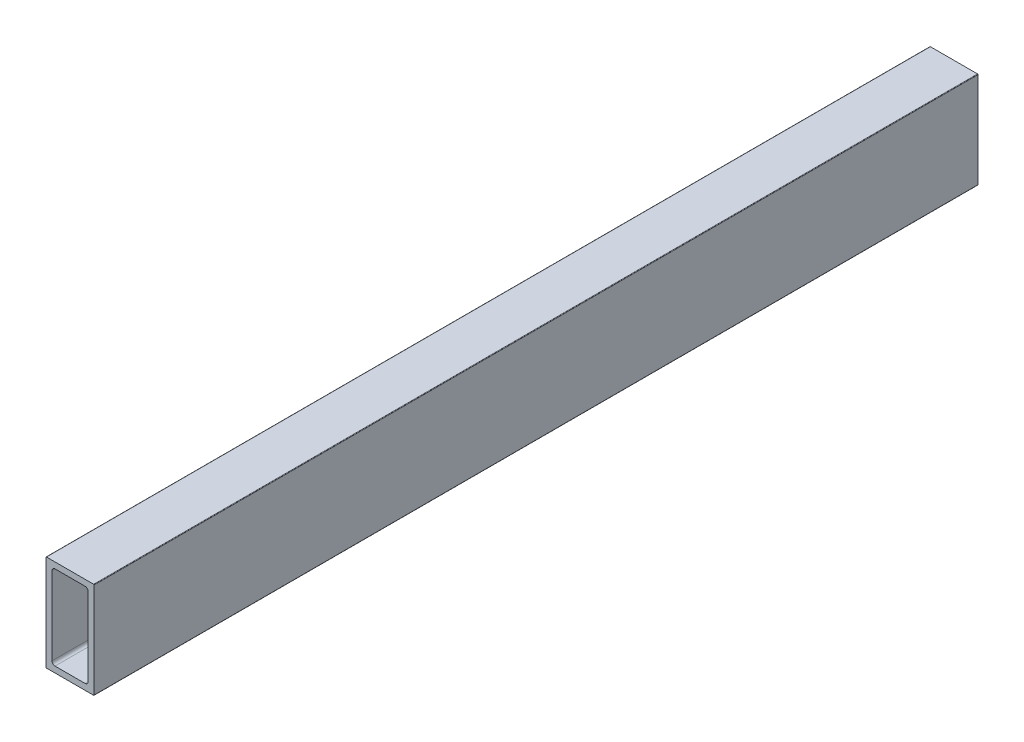
ISO-10303-21;
HEADER;
FILE_DESCRIPTION(('STEP AP214'),'2;1');
FILE_NAME('part.step','',(''),(''),'','','');
FILE_SCHEMA(('AUTOMOTIVE_DESIGN { 1 0 10303 214 1 1 1 1 }'));
ENDSEC;
DATA;
#1=APPLICATION_CONTEXT('core data for automotive mechanical design processes');
#2=APPLICATION_PROTOCOL_DEFINITION('international standard','automotive_design',2000,#1);
#3=PRODUCT_CONTEXT('',#1,'mechanical');
#4=PRODUCT('Part','Part','',(#3));
#5=PRODUCT_RELATED_PRODUCT_CATEGORY('part','',(#4));
#6=PRODUCT_DEFINITION_FORMATION('','',#4);
#7=PRODUCT_DEFINITION_CONTEXT('part definition',#1,'design');
#8=PRODUCT_DEFINITION('design','',#6,#7);
#9=PRODUCT_DEFINITION_SHAPE('','',#8);
#10=(LENGTH_UNIT() NAMED_UNIT(*) SI_UNIT(.MILLI.,.METRE.));
#11=(NAMED_UNIT(*) PLANE_ANGLE_UNIT() SI_UNIT($,.RADIAN.));
#12=(NAMED_UNIT(*) SI_UNIT($,.STERADIAN.) SOLID_ANGLE_UNIT());
#13=UNCERTAINTY_MEASURE_WITH_UNIT(LENGTH_MEASURE(1.E-05),#10,'distance_accuracy_value','');
#14=(GEOMETRIC_REPRESENTATION_CONTEXT(3) GLOBAL_UNCERTAINTY_ASSIGNED_CONTEXT((#13)) GLOBAL_UNIT_ASSIGNED_CONTEXT((#10,
#11,#12)) REPRESENTATION_CONTEXT('',''));
#15=CARTESIAN_POINT('',(0.,0.,0.));
#16=DIRECTION('',(0.,0.,1.));
#17=DIRECTION('',(1.,0.,0.));
#18=AXIS2_PLACEMENT_3D('',#15,#16,#17);
#19=CARTESIAN_POINT('',(3.175,4.7625,1828.8));
#20=DIRECTION('',(1.,0.,0.));
#21=DIRECTION('',(0.,1.,0.));
#22=AXIS2_PLACEMENT_3D('',#19,#20,#21);
#23=PLANE('',#22);
#24=DIRECTION('',(0.,1.,0.));
#25=VECTOR('',#24,1.);
#26=CARTESIAN_POINT('',(3.175,4.76250000000024,466.725));
#27=LINE('',#26,#25);
#28=CARTESIAN_POINT('',(3.175,4.7625,466.725));
#29=VERTEX_POINT('',#28);
#30=CARTESIAN_POINT('',(3.175,46.0375,466.725));
#31=VERTEX_POINT('',#30);
#32=EDGE_CURVE('E241',#29,#31,#27,.T.);
#33=ORIENTED_EDGE('',*,*,#32,.F.);
#34=DIRECTION('',(0.,0.,-1.));
#35=VECTOR('',#34,1.);
#36=CARTESIAN_POINT('',(3.175,4.7625,1828.8));
#37=LINE('',#36,#35);
#38=CARTESIAN_POINT('',(3.175,4.7625,0.));
#39=VERTEX_POINT('',#38);
#40=EDGE_CURVE('E211',#29,#39,#37,.T.);
#41=ORIENTED_EDGE('',*,*,#40,.T.);
#42=DIRECTION('',(0.,-1.,0.));
#43=VECTOR('',#42,1.);
#44=CARTESIAN_POINT('',(3.175,4.7625,0.));
#45=LINE('',#44,#43);
#46=CARTESIAN_POINT('',(3.175,46.0375,0.));
#47=VERTEX_POINT('',#46);
#48=EDGE_CURVE('E247',#47,#39,#45,.T.);
#49=ORIENTED_EDGE('',*,*,#48,.F.);
#50=DIRECTION('',(0.,0.,-1.));
#51=VECTOR('',#50,1.);
#52=CARTESIAN_POINT('',(3.175,46.0375,1828.8));
#53=LINE('',#52,#51);
#54=EDGE_CURVE('E51',#31,#47,#53,.T.);
#55=ORIENTED_EDGE('',*,*,#54,.F.);
#56=EDGE_LOOP('',(#33,#41,#49,#55));
#57=FACE_BOUND('',#56,.T.);
#58=ADVANCED_FACE('F43',(#57),#23,.T.);
#59=CARTESIAN_POINT('',(4.7625,46.0375,1828.8));
#60=DIRECTION('',(0.,0.,-1.));
#61=DIRECTION('',(-1.,0.,0.));
#62=AXIS2_PLACEMENT_3D('',#59,#60,#61);
#63=CYLINDRICAL_SURFACE('',#62,1.5875);
#64=DIRECTION('',(0.,0.,-1.));
#65=VECTOR('',#64,1.);
#66=CARTESIAN_POINT('',(4.7625,47.625,1828.8));
#67=LINE('',#66,#65);
#68=CARTESIAN_POINT('',(4.7625,47.625,466.725));
#69=VERTEX_POINT('',#68);
#70=CARTESIAN_POINT('',(4.7625,47.625,0.));
#71=VERTEX_POINT('',#70);
#72=EDGE_CURVE('E223',#69,#71,#67,.T.);
#73=ORIENTED_EDGE('',*,*,#72,.F.);
#74=CARTESIAN_POINT('',(4.7625,46.0375,466.725));
#75=DIRECTION('',(0.,0.,-1.));
#76=DIRECTION('',(0.,1.,0.));
#77=AXIS2_PLACEMENT_3D('',#74,#75,#76);
#78=CIRCLE('',#77,1.5875);
#79=EDGE_CURVE('E355',#69,#31,#78,.F.);
#80=ORIENTED_EDGE('',*,*,#79,.T.);
#81=ORIENTED_EDGE('',*,*,#54,.T.);
#82=CARTESIAN_POINT('',(4.7625,46.0375,0.));
#83=DIRECTION('',(0.,0.,1.));
#84=DIRECTION('',(-1.,0.,0.));
#85=AXIS2_PLACEMENT_3D('',#82,#83,#84);
#86=CIRCLE('',#85,1.5875);
#87=EDGE_CURVE('E295',#71,#47,#86,.T.);
#88=ORIENTED_EDGE('',*,*,#87,.F.);
#89=EDGE_LOOP('',(#73,#80,#81,#88));
#90=FACE_BOUND('',#89,.T.);
#91=ADVANCED_FACE('F536',(#90),#63,.F.);
#92=CARTESIAN_POINT('',(4.7625,47.625,1828.8));
#93=DIRECTION('',(0.,-1.,0.));
#94=DIRECTION('',(0.,0.,-1.));
#95=AXIS2_PLACEMENT_3D('',#92,#93,#94);
#96=PLANE('',#95);
#97=DIRECTION('',(1.,0.,0.));
#98=VECTOR('',#97,1.);
#99=CARTESIAN_POINT('',(4.7625,47.625,466.725));
#100=LINE('',#99,#98);
#101=CARTESIAN_POINT('',(20.6375,47.625,466.725));
#102=VERTEX_POINT('',#101);
#103=EDGE_CURVE('E358',#69,#102,#100,.T.);
#104=ORIENTED_EDGE('',*,*,#103,.F.);
#105=ORIENTED_EDGE('',*,*,#72,.T.);
#106=DIRECTION('',(-1.,0.,0.));
#107=VECTOR('',#106,1.);
#108=CARTESIAN_POINT('',(4.7625,47.625,0.));
#109=LINE('',#108,#107);
#110=CARTESIAN_POINT('',(20.6375,47.625,0.));
#111=VERTEX_POINT('',#110);
#112=EDGE_CURVE('E288',#111,#71,#109,.T.);
#113=ORIENTED_EDGE('',*,*,#112,.F.);
#114=DIRECTION('',(0.,0.,-1.));
#115=VECTOR('',#114,1.);
#116=CARTESIAN_POINT('',(20.6375,47.625,1828.8));
#117=LINE('',#116,#115);
#118=EDGE_CURVE('E235',#102,#111,#117,.T.);
#119=ORIENTED_EDGE('',*,*,#118,.F.);
#120=EDGE_LOOP('',(#104,#105,#113,#119));
#121=FACE_BOUND('',#120,.T.);
#122=ADVANCED_FACE('F529',(#121),#96,.T.);
#123=CARTESIAN_POINT('',(20.6375,46.0375,1828.8));
#124=DIRECTION('',(0.,0.,-1.));
#125=DIRECTION('',(-1.,0.,0.));
#126=AXIS2_PLACEMENT_3D('',#123,#124,#125);
#127=CYLINDRICAL_SURFACE('',#126,1.5875);
#128=DIRECTION('',(0.,0.,-1.));
#129=VECTOR('',#128,1.);
#130=CARTESIAN_POINT('',(22.225,46.0375,1828.8));
#131=LINE('',#130,#129);
#132=CARTESIAN_POINT('',(22.225,46.0375,466.725));
#133=VERTEX_POINT('',#132);
#134=CARTESIAN_POINT('',(22.225,46.0375,0.));
#135=VERTEX_POINT('',#134);
#136=EDGE_CURVE('E232',#133,#135,#131,.T.);
#137=ORIENTED_EDGE('',*,*,#136,.F.);
#138=CARTESIAN_POINT('',(20.6375,46.0375,466.725));
#139=DIRECTION('',(0.,0.,-1.));
#140=DIRECTION('',(0.,1.,0.));
#141=AXIS2_PLACEMENT_3D('',#138,#139,#140);
#142=CIRCLE('',#141,1.5875);
#143=EDGE_CURVE('E360',#133,#102,#142,.F.);
#144=ORIENTED_EDGE('',*,*,#143,.T.);
#145=ORIENTED_EDGE('',*,*,#118,.T.);
#146=CARTESIAN_POINT('',(20.6375,46.0375,0.));
#147=DIRECTION('',(0.,0.,1.));
#148=DIRECTION('',(-1.,0.,0.));
#149=AXIS2_PLACEMENT_3D('',#146,#147,#148);
#150=CIRCLE('',#149,1.5875);
#151=EDGE_CURVE('E284',#135,#111,#150,.T.);
#152=ORIENTED_EDGE('',*,*,#151,.F.);
#153=EDGE_LOOP('',(#137,#144,#145,#152));
#154=FACE_BOUND('',#153,.T.);
#155=ADVANCED_FACE('F341',(#154),#127,.F.);
#156=CARTESIAN_POINT('',(22.225,4.7625,1828.8));
#157=DIRECTION('',(-1.,0.,0.));
#158=DIRECTION('',(0.,0.,1.));
#159=AXIS2_PLACEMENT_3D('',#156,#157,#158);
#160=PLANE('',#159);
#161=DIRECTION('',(0.,-1.,0.));
#162=VECTOR('',#161,1.);
#163=CARTESIAN_POINT('',(22.225,4.76250000000024,466.725));
#164=LINE('',#163,#162);
#165=CARTESIAN_POINT('',(22.225,4.7625,466.725));
#166=VERTEX_POINT('',#165);
#167=EDGE_CURVE('E338',#133,#166,#164,.T.);
#168=ORIENTED_EDGE('',*,*,#167,.F.);
#169=ORIENTED_EDGE('',*,*,#136,.T.);
#170=DIRECTION('',(0.,1.,0.));
#171=VECTOR('',#170,1.);
#172=CARTESIAN_POINT('',(22.225,4.7625,0.));
#173=LINE('',#172,#171);
#174=CARTESIAN_POINT('',(22.225,4.7625,0.));
#175=VERTEX_POINT('',#174);
#176=EDGE_CURVE('E289',#175,#135,#173,.T.);
#177=ORIENTED_EDGE('',*,*,#176,.F.);
#178=DIRECTION('',(0.,0.,-1.));
#179=VECTOR('',#178,1.);
#180=CARTESIAN_POINT('',(22.225,4.7625,1828.8));
#181=LINE('',#180,#179);
#182=EDGE_CURVE('E216',#166,#175,#181,.T.);
#183=ORIENTED_EDGE('',*,*,#182,.F.);
#184=EDGE_LOOP('',(#168,#169,#177,#183));
#185=FACE_BOUND('',#184,.T.);
#186=ADVANCED_FACE('F335',(#185),#160,.T.);
#187=CARTESIAN_POINT('',(20.6375,4.7625,1828.8));
#188=DIRECTION('',(0.,0.,-1.));
#189=DIRECTION('',(-1.,0.,0.));
#190=AXIS2_PLACEMENT_3D('',#187,#188,#189);
#191=CYLINDRICAL_SURFACE('',#190,1.5875);
#192=DIRECTION('',(0.,0.,-1.));
#193=VECTOR('',#192,1.);
#194=CARTESIAN_POINT('',(20.6375,3.175,1828.8));
#195=LINE('',#194,#193);
#196=CARTESIAN_POINT('',(20.6375,3.175,466.725));
#197=VERTEX_POINT('',#196);
#198=CARTESIAN_POINT('',(20.6375,3.175,0.));
#199=VERTEX_POINT('',#198);
#200=EDGE_CURVE('E213',#197,#199,#195,.T.);
#201=ORIENTED_EDGE('',*,*,#200,.F.);
#202=CARTESIAN_POINT('',(20.6375,4.7625,466.725));
#203=DIRECTION('',(0.,0.,-1.));
#204=DIRECTION('',(0.,1.,0.));
#205=AXIS2_PLACEMENT_3D('',#202,#203,#204);
#206=CIRCLE('',#205,1.5875);
#207=EDGE_CURVE('E332',#197,#166,#206,.F.);
#208=ORIENTED_EDGE('',*,*,#207,.T.);
#209=ORIENTED_EDGE('',*,*,#182,.T.);
#210=CARTESIAN_POINT('',(20.6375,4.7625,0.));
#211=DIRECTION('',(0.,0.,1.));
#212=DIRECTION('',(-1.,0.,0.));
#213=AXIS2_PLACEMENT_3D('',#210,#211,#212);
#214=CIRCLE('',#213,1.5875);
#215=EDGE_CURVE('E205',#199,#175,#214,.T.);
#216=ORIENTED_EDGE('',*,*,#215,.F.);
#217=EDGE_LOOP('',(#201,#208,#209,#216));
#218=FACE_BOUND('',#217,.T.);
#219=ADVANCED_FACE('F329',(#218),#191,.F.);
#220=CARTESIAN_POINT('',(4.7625,3.175,1828.8));
#221=DIRECTION('',(0.,1.,0.));
#222=DIRECTION('',(1.,0.,0.));
#223=AXIS2_PLACEMENT_3D('',#220,#221,#222);
#224=PLANE('',#223);
#225=DIRECTION('',(-1.,0.,0.));
#226=VECTOR('',#225,1.);
#227=CARTESIAN_POINT('',(4.7625,3.175,466.725));
#228=LINE('',#227,#226);
#229=CARTESIAN_POINT('',(4.7625,3.175,466.725));
#230=VERTEX_POINT('',#229);
#231=EDGE_CURVE('E58',#197,#230,#228,.T.);
#232=ORIENTED_EDGE('',*,*,#231,.F.);
#233=ORIENTED_EDGE('',*,*,#200,.T.);
#234=DIRECTION('',(1.,0.,0.));
#235=VECTOR('',#234,1.);
#236=CARTESIAN_POINT('',(4.7625,3.175,0.));
#237=LINE('',#236,#235);
#238=CARTESIAN_POINT('',(4.7625,3.175,0.));
#239=VERTEX_POINT('',#238);
#240=EDGE_CURVE('E242',#239,#199,#237,.T.);
#241=ORIENTED_EDGE('',*,*,#240,.F.);
#242=DIRECTION('',(0.,0.,-1.));
#243=VECTOR('',#242,1.);
#244=CARTESIAN_POINT('',(4.7625,3.175,1828.8));
#245=LINE('',#244,#243);
#246=EDGE_CURVE('E217',#230,#239,#245,.T.);
#247=ORIENTED_EDGE('',*,*,#246,.F.);
#248=EDGE_LOOP('',(#232,#233,#241,#247));
#249=FACE_BOUND('',#248,.T.);
#250=ADVANCED_FACE('F262',(#249),#224,.T.);
#251=CARTESIAN_POINT('',(4.7625,4.7625,1828.8));
#252=DIRECTION('',(0.,0.,-1.));
#253=DIRECTION('',(-1.,0.,0.));
#254=AXIS2_PLACEMENT_3D('',#251,#252,#253);
#255=CYLINDRICAL_SURFACE('',#254,1.5875);
#256=ORIENTED_EDGE('',*,*,#40,.F.);
#257=CARTESIAN_POINT('',(4.7625,4.7625,466.725));
#258=DIRECTION('',(0.,0.,-1.));
#259=DIRECTION('',(0.,1.,0.));
#260=AXIS2_PLACEMENT_3D('',#257,#258,#259);
#261=CIRCLE('',#260,1.5875);
#262=EDGE_CURVE('E260',#29,#230,#261,.F.);
#263=ORIENTED_EDGE('',*,*,#262,.T.);
#264=ORIENTED_EDGE('',*,*,#246,.T.);
#265=CARTESIAN_POINT('',(4.7625,4.7625,0.));
#266=DIRECTION('',(0.,0.,1.));
#267=DIRECTION('',(1.,0.,0.));
#268=AXIS2_PLACEMENT_3D('',#265,#266,#267);
#269=CIRCLE('',#268,1.5875);
#270=EDGE_CURVE('E246',#39,#239,#269,.T.);
#271=ORIENTED_EDGE('',*,*,#270,.F.);
#272=EDGE_LOOP('',(#256,#263,#264,#271));
#273=FACE_BOUND('',#272,.T.);
#274=ADVANCED_FACE('F258',(#273),#255,.F.);
#275=CARTESIAN_POINT('',(0.,0.254,1828.8));
#276=DIRECTION('',(1.,0.,0.));
#277=DIRECTION('',(0.,1.,0.));
#278=AXIS2_PLACEMENT_3D('',#275,#276,#277);
#279=PLANE('',#278);
#280=DIRECTION('',(0.,0.,-1.));
#281=VECTOR('',#280,1.);
#282=CARTESIAN_POINT('',(0.,0.254,1828.8));
#283=LINE('',#282,#281);
#284=CARTESIAN_POINT('',(0.,0.254,466.725));
#285=VERTEX_POINT('',#284);
#286=CARTESIAN_POINT('',(0.,0.254,0.));
#287=VERTEX_POINT('',#286);
#288=EDGE_CURVE('E202',#285,#287,#283,.T.);
#289=ORIENTED_EDGE('',*,*,#288,.F.);
#290=DIRECTION('',(0.,1.,0.));
#291=VECTOR('',#290,1.);
#292=CARTESIAN_POINT('',(0.,269.220692931555,466.725));
#293=LINE('',#292,#291);
#294=CARTESIAN_POINT('',(0.,50.546,466.725));
#295=VERTEX_POINT('',#294);
#296=EDGE_CURVE('E65',#285,#295,#293,.T.);
#297=ORIENTED_EDGE('',*,*,#296,.T.);
#298=DIRECTION('',(0.,0.,-1.));
#299=VECTOR('',#298,1.);
#300=CARTESIAN_POINT('',(0.,50.546,1828.8));
#301=LINE('',#300,#299);
#302=CARTESIAN_POINT('',(0.,50.546,0.));
#303=VERTEX_POINT('',#302);
#304=EDGE_CURVE('E208',#295,#303,#301,.T.);
#305=ORIENTED_EDGE('',*,*,#304,.T.);
#306=DIRECTION('',(0.,-1.,0.));
#307=VECTOR('',#306,1.);
#308=CARTESIAN_POINT('',(0.,0.254,0.));
#309=LINE('',#308,#307);
#310=EDGE_CURVE('E240',#303,#287,#309,.T.);
#311=ORIENTED_EDGE('',*,*,#310,.T.);
#312=EDGE_LOOP('',(#289,#297,#305,#311));
#313=FACE_BOUND('',#312,.T.);
#314=ADVANCED_FACE('F375',(#313),#279,.F.);
#315=CARTESIAN_POINT('',(0.254,50.546,1828.8));
#316=DIRECTION('',(0.,0.,-1.));
#317=DIRECTION('',(-1.,0.,0.));
#318=AXIS2_PLACEMENT_3D('',#315,#316,#317);
#319=CYLINDRICAL_SURFACE('',#318,0.253999999999995);
#320=CARTESIAN_POINT('',(0.254,50.546,466.725));
#321=DIRECTION('',(0.,0.,-1.));
#322=DIRECTION('',(0.,1.,0.));
#323=AXIS2_PLACEMENT_3D('',#320,#321,#322);
#324=CIRCLE('',#323,0.253999999999995);
#325=CARTESIAN_POINT('',(0.254,50.8,466.725));
#326=VERTEX_POINT('',#325);
#327=EDGE_CURVE('E366',#326,#295,#324,.F.);
#328=ORIENTED_EDGE('',*,*,#327,.F.);
#329=DIRECTION('',(0.,0.,-1.));
#330=VECTOR('',#329,1.);
#331=CARTESIAN_POINT('',(0.254,50.8,1828.8));
#332=LINE('',#331,#330);
#333=CARTESIAN_POINT('',(0.254,50.8,0.));
#334=VERTEX_POINT('',#333);
#335=EDGE_CURVE('E212',#326,#334,#332,.T.);
#336=ORIENTED_EDGE('',*,*,#335,.T.);
#337=CARTESIAN_POINT('',(0.254,50.546,0.));
#338=DIRECTION('',(0.,0.,1.));
#339=DIRECTION('',(-1.,0.,0.));
#340=AXIS2_PLACEMENT_3D('',#337,#338,#339);
#341=CIRCLE('',#340,0.253999999999995);
#342=EDGE_CURVE('E277',#334,#303,#341,.T.);
#343=ORIENTED_EDGE('',*,*,#342,.T.);
#344=ORIENTED_EDGE('',*,*,#304,.F.);
#345=EDGE_LOOP('',(#328,#336,#343,#344));
#346=FACE_BOUND('',#345,.T.);
#347=ADVANCED_FACE('F45',(#346),#319,.T.);
#348=CARTESIAN_POINT('',(0.254,50.8,1828.8));
#349=DIRECTION('',(0.,-1.,0.));
#350=DIRECTION('',(0.,0.,-1.));
#351=AXIS2_PLACEMENT_3D('',#348,#349,#350);
#352=PLANE('',#351);
#353=ORIENTED_EDGE('',*,*,#335,.F.);
#354=DIRECTION('',(1.,0.,0.));
#355=VECTOR('',#354,1.);
#356=CARTESIAN_POINT('',(0.254,50.8,466.725));
#357=LINE('',#356,#355);
#358=CARTESIAN_POINT('',(25.146,50.8,466.725));
#359=VERTEX_POINT('',#358);
#360=EDGE_CURVE('E368',#326,#359,#357,.T.);
#361=ORIENTED_EDGE('',*,*,#360,.T.);
#362=DIRECTION('',(0.,0.,-1.));
#363=VECTOR('',#362,1.);
#364=CARTESIAN_POINT('',(25.146,50.8,1828.8));
#365=LINE('',#364,#363);
#366=CARTESIAN_POINT('',(25.146,50.8,0.));
#367=VERTEX_POINT('',#366);
#368=EDGE_CURVE('E200',#359,#367,#365,.T.);
#369=ORIENTED_EDGE('',*,*,#368,.T.);
#370=DIRECTION('',(-1.,0.,0.));
#371=VECTOR('',#370,1.);
#372=CARTESIAN_POINT('',(0.254,50.8,0.));
#373=LINE('',#372,#371);
#374=EDGE_CURVE('E229',#367,#334,#373,.T.);
#375=ORIENTED_EDGE('',*,*,#374,.T.);
#376=EDGE_LOOP('',(#353,#361,#369,#375));
#377=FACE_BOUND('',#376,.T.);
#378=ADVANCED_FACE('F477',(#377),#352,.F.);
#379=CARTESIAN_POINT('',(25.146,50.546,1828.8));
#380=DIRECTION('',(0.,0.,-1.));
#381=DIRECTION('',(-1.,0.,0.));
#382=AXIS2_PLACEMENT_3D('',#379,#380,#381);
#383=CYLINDRICAL_SURFACE('',#382,0.253999999999994);
#384=CARTESIAN_POINT('',(25.146,50.546,466.725));
#385=DIRECTION('',(0.,0.,-1.));
#386=DIRECTION('',(0.,1.,0.));
#387=AXIS2_PLACEMENT_3D('',#384,#385,#386);
#388=CIRCLE('',#387,0.253999999999994);
#389=CARTESIAN_POINT('',(25.4,50.546,466.725));
#390=VERTEX_POINT('',#389);
#391=EDGE_CURVE('E179',#390,#359,#388,.F.);
#392=ORIENTED_EDGE('',*,*,#391,.F.);
#393=DIRECTION('',(0.,0.,-1.));
#394=VECTOR('',#393,1.);
#395=CARTESIAN_POINT('',(25.4,50.546,1828.8));
#396=LINE('',#395,#394);
#397=CARTESIAN_POINT('',(25.4,50.546,0.));
#398=VERTEX_POINT('',#397);
#399=EDGE_CURVE('E187',#390,#398,#396,.T.);
#400=ORIENTED_EDGE('',*,*,#399,.T.);
#401=CARTESIAN_POINT('',(25.146,50.546,0.));
#402=DIRECTION('',(0.,0.,1.));
#403=DIRECTION('',(-1.,0.,0.));
#404=AXIS2_PLACEMENT_3D('',#401,#402,#403);
#405=CIRCLE('',#404,0.253999999999994);
#406=EDGE_CURVE('E225',#398,#367,#405,.T.);
#407=ORIENTED_EDGE('',*,*,#406,.T.);
#408=ORIENTED_EDGE('',*,*,#368,.F.);
#409=EDGE_LOOP('',(#392,#400,#407,#408));
#410=FACE_BOUND('',#409,.T.);
#411=ADVANCED_FACE('F467',(#410),#383,.T.);
#412=CARTESIAN_POINT('',(25.4,0.254,1828.8));
#413=DIRECTION('',(-1.,0.,0.));
#414=DIRECTION('',(0.,0.,1.));
#415=AXIS2_PLACEMENT_3D('',#412,#413,#414);
#416=PLANE('',#415);
#417=ORIENTED_EDGE('',*,*,#399,.F.);
#418=DIRECTION('',(0.,1.,0.));
#419=VECTOR('',#418,1.);
#420=CARTESIAN_POINT('',(25.4,269.220692931555,466.725));
#421=LINE('',#420,#419);
#422=CARTESIAN_POINT('',(25.4,0.253999999999976,466.725));
#423=VERTEX_POINT('',#422);
#424=EDGE_CURVE('E172',#423,#390,#421,.T.);
#425=ORIENTED_EDGE('',*,*,#424,.F.);
#426=DIRECTION('',(0.,0.,-1.));
#427=VECTOR('',#426,1.);
#428=CARTESIAN_POINT('',(25.4,0.254,1828.8));
#429=LINE('',#428,#427);
#430=CARTESIAN_POINT('',(25.4,0.254,0.));
#431=VERTEX_POINT('',#430);
#432=EDGE_CURVE('E185',#423,#431,#429,.T.);
#433=ORIENTED_EDGE('',*,*,#432,.T.);
#434=DIRECTION('',(0.,1.,0.));
#435=VECTOR('',#434,1.);
#436=CARTESIAN_POINT('',(25.4,0.254,0.));
#437=LINE('',#436,#435);
#438=EDGE_CURVE('E221',#431,#398,#437,.T.);
#439=ORIENTED_EDGE('',*,*,#438,.T.);
#440=EDGE_LOOP('',(#417,#425,#433,#439));
#441=FACE_BOUND('',#440,.T.);
#442=ADVANCED_FACE('F183',(#441),#416,.F.);
#443=CARTESIAN_POINT('',(25.146,0.254,1828.8));
#444=DIRECTION('',(0.,0.,-1.));
#445=DIRECTION('',(-1.,0.,0.));
#446=AXIS2_PLACEMENT_3D('',#443,#444,#445);
#447=CYLINDRICAL_SURFACE('',#446,0.254);
#448=CARTESIAN_POINT('',(25.146,0.254,466.725));
#449=DIRECTION('',(0.,0.,-1.));
#450=DIRECTION('',(0.,1.,0.));
#451=AXIS2_PLACEMENT_3D('',#448,#449,#450);
#452=CIRCLE('',#451,0.254);
#453=CARTESIAN_POINT('',(25.146,0.,466.725));
#454=VERTEX_POINT('',#453);
#455=EDGE_CURVE('E169',#454,#423,#452,.F.);
#456=ORIENTED_EDGE('',*,*,#455,.F.);
#457=DIRECTION('',(0.,0.,-1.));
#458=VECTOR('',#457,1.);
#459=CARTESIAN_POINT('',(25.146,0.,1828.8));
#460=LINE('',#459,#458);
#461=CARTESIAN_POINT('',(25.146,0.,0.));
#462=VERTEX_POINT('',#461);
#463=EDGE_CURVE('E194',#454,#462,#460,.T.);
#464=ORIENTED_EDGE('',*,*,#463,.T.);
#465=CARTESIAN_POINT('',(25.146,0.254,0.));
#466=DIRECTION('',(0.,0.,1.));
#467=DIRECTION('',(1.,0.,0.));
#468=AXIS2_PLACEMENT_3D('',#465,#466,#467);
#469=CIRCLE('',#468,0.254);
#470=EDGE_CURVE('E191',#462,#431,#469,.T.);
#471=ORIENTED_EDGE('',*,*,#470,.T.);
#472=ORIENTED_EDGE('',*,*,#432,.F.);
#473=EDGE_LOOP('',(#456,#464,#471,#472));
#474=FACE_BOUND('',#473,.T.);
#475=ADVANCED_FACE('F189',(#474),#447,.T.);
#476=CARTESIAN_POINT('',(0.254,0.,1828.8));
#477=DIRECTION('',(0.,1.,0.));
#478=DIRECTION('',(1.,0.,0.));
#479=AXIS2_PLACEMENT_3D('',#476,#477,#478);
#480=PLANE('',#479);
#481=ORIENTED_EDGE('',*,*,#463,.F.);
#482=DIRECTION('',(-1.,0.,0.));
#483=VECTOR('',#482,1.);
#484=CARTESIAN_POINT('',(0.254,0.,466.725));
#485=LINE('',#484,#483);
#486=CARTESIAN_POINT('',(0.254,0.,466.725));
#487=VERTEX_POINT('',#486);
#488=EDGE_CURVE('E175',#454,#487,#485,.T.);
#489=ORIENTED_EDGE('',*,*,#488,.T.);
#490=DIRECTION('',(0.,0.,-1.));
#491=VECTOR('',#490,1.);
#492=CARTESIAN_POINT('',(0.254,0.,1828.8));
#493=LINE('',#492,#491);
#494=CARTESIAN_POINT('',(0.254,0.,0.));
#495=VERTEX_POINT('',#494);
#496=EDGE_CURVE('E292',#487,#495,#493,.T.);
#497=ORIENTED_EDGE('',*,*,#496,.T.);
#498=DIRECTION('',(1.,0.,0.));
#499=VECTOR('',#498,1.);
#500=CARTESIAN_POINT('',(0.254,0.,0.));
#501=LINE('',#500,#499);
#502=EDGE_CURVE('E220',#495,#462,#501,.T.);
#503=ORIENTED_EDGE('',*,*,#502,.T.);
#504=EDGE_LOOP('',(#481,#489,#497,#503));
#505=FACE_BOUND('',#504,.T.);
#506=ADVANCED_FACE('F439',(#505),#480,.F.);
#507=CARTESIAN_POINT('',(0.254,0.254,1828.8));
#508=DIRECTION('',(0.,0.,-1.));
#509=DIRECTION('',(-1.,0.,0.));
#510=AXIS2_PLACEMENT_3D('',#507,#508,#509);
#511=CYLINDRICAL_SURFACE('',#510,0.254);
#512=CARTESIAN_POINT('',(0.254,0.254,466.725));
#513=DIRECTION('',(0.,0.,-1.));
#514=DIRECTION('',(0.,1.,0.));
#515=AXIS2_PLACEMENT_3D('',#512,#513,#514);
#516=CIRCLE('',#515,0.254);
#517=EDGE_CURVE('E11',#285,#487,#516,.F.);
#518=ORIENTED_EDGE('',*,*,#517,.F.);
#519=ORIENTED_EDGE('',*,*,#288,.T.);
#520=CARTESIAN_POINT('',(0.254,0.254,0.));
#521=DIRECTION('',(0.,0.,1.));
#522=DIRECTION('',(-1.,0.,0.));
#523=AXIS2_PLACEMENT_3D('',#520,#521,#522);
#524=CIRCLE('',#523,0.254);
#525=EDGE_CURVE('E236',#287,#495,#524,.T.);
#526=ORIENTED_EDGE('',*,*,#525,.T.);
#527=ORIENTED_EDGE('',*,*,#496,.F.);
#528=EDGE_LOOP('',(#518,#519,#526,#527));
#529=FACE_BOUND('',#528,.T.);
#530=ADVANCED_FACE('F384',(#529),#511,.T.);
#531=CARTESIAN_POINT('',(0.254,0.254,0.));
#532=DIRECTION('',(0.,0.,-1.));
#533=DIRECTION('',(0.,-1.,0.));
#534=AXIS2_PLACEMENT_3D('',#531,#532,#533);
#535=PLANE('',#534);
#536=ORIENTED_EDGE('',*,*,#48,.T.);
#537=ORIENTED_EDGE('',*,*,#270,.T.);
#538=ORIENTED_EDGE('',*,*,#240,.T.);
#539=ORIENTED_EDGE('',*,*,#215,.T.);
#540=ORIENTED_EDGE('',*,*,#176,.T.);
#541=ORIENTED_EDGE('',*,*,#151,.T.);
#542=ORIENTED_EDGE('',*,*,#112,.T.);
#543=ORIENTED_EDGE('',*,*,#87,.T.);
#544=EDGE_LOOP('',(#536,#537,#538,#539,#540,#541,#542,#543));
#545=FACE_BOUND('',#544,.T.);
#546=ORIENTED_EDGE('',*,*,#525,.F.);
#547=ORIENTED_EDGE('',*,*,#310,.F.);
#548=ORIENTED_EDGE('',*,*,#342,.F.);
#549=ORIENTED_EDGE('',*,*,#374,.F.);
#550=ORIENTED_EDGE('',*,*,#406,.F.);
#551=ORIENTED_EDGE('',*,*,#438,.F.);
#552=ORIENTED_EDGE('',*,*,#470,.F.);
#553=ORIENTED_EDGE('',*,*,#502,.F.);
#554=EDGE_LOOP('',(#546,#547,#548,#549,#550,#551,#552,#553));
#555=FACE_BOUND('',#554,.T.);
#556=ADVANCED_FACE('F267',(#545,#555),#535,.T.);
#557=CARTESIAN_POINT('',(0.,269.220692931555,466.725));
#558=DIRECTION('',(0.,0.,-1.));
#559=DIRECTION('',(0.,1.,0.));
#560=AXIS2_PLACEMENT_3D('',#557,#558,#559);
#561=PLANE('',#560);
#562=ORIENTED_EDGE('',*,*,#32,.T.);
#563=ORIENTED_EDGE('',*,*,#79,.F.);
#564=ORIENTED_EDGE('',*,*,#103,.T.);
#565=ORIENTED_EDGE('',*,*,#143,.F.);
#566=ORIENTED_EDGE('',*,*,#167,.T.);
#567=ORIENTED_EDGE('',*,*,#207,.F.);
#568=ORIENTED_EDGE('',*,*,#231,.T.);
#569=ORIENTED_EDGE('',*,*,#262,.F.);
#570=EDGE_LOOP('',(#562,#563,#564,#565,#566,#567,#568,#569));
#571=FACE_BOUND('',#570,.T.);
#572=ORIENTED_EDGE('',*,*,#327,.T.);
#573=ORIENTED_EDGE('',*,*,#296,.F.);
#574=ORIENTED_EDGE('',*,*,#517,.T.);
#575=ORIENTED_EDGE('',*,*,#488,.F.);
#576=ORIENTED_EDGE('',*,*,#455,.T.);
#577=ORIENTED_EDGE('',*,*,#424,.T.);
#578=ORIENTED_EDGE('',*,*,#391,.T.);
#579=ORIENTED_EDGE('',*,*,#360,.F.);
#580=EDGE_LOOP('',(#572,#573,#574,#575,#576,#577,#578,#579));
#581=FACE_BOUND('',#580,.T.);
#582=ADVANCED_FACE('F171',(#571,#581),#561,.F.);
#583=CLOSED_SHELL('',(#58,#91,#122,#155,#186,#219,#250,#274,#314,#347,#378,#411,#442,#475,#506,
#530,#556,#582));
#584=MANIFOLD_SOLID_BREP('B2',#583);
#585=ADVANCED_BREP_SHAPE_REPRESENTATION('',(#18,#584),#14);
#586=SHAPE_DEFINITION_REPRESENTATION(#9,#585);
ENDSEC;
END-ISO-10303-21;
